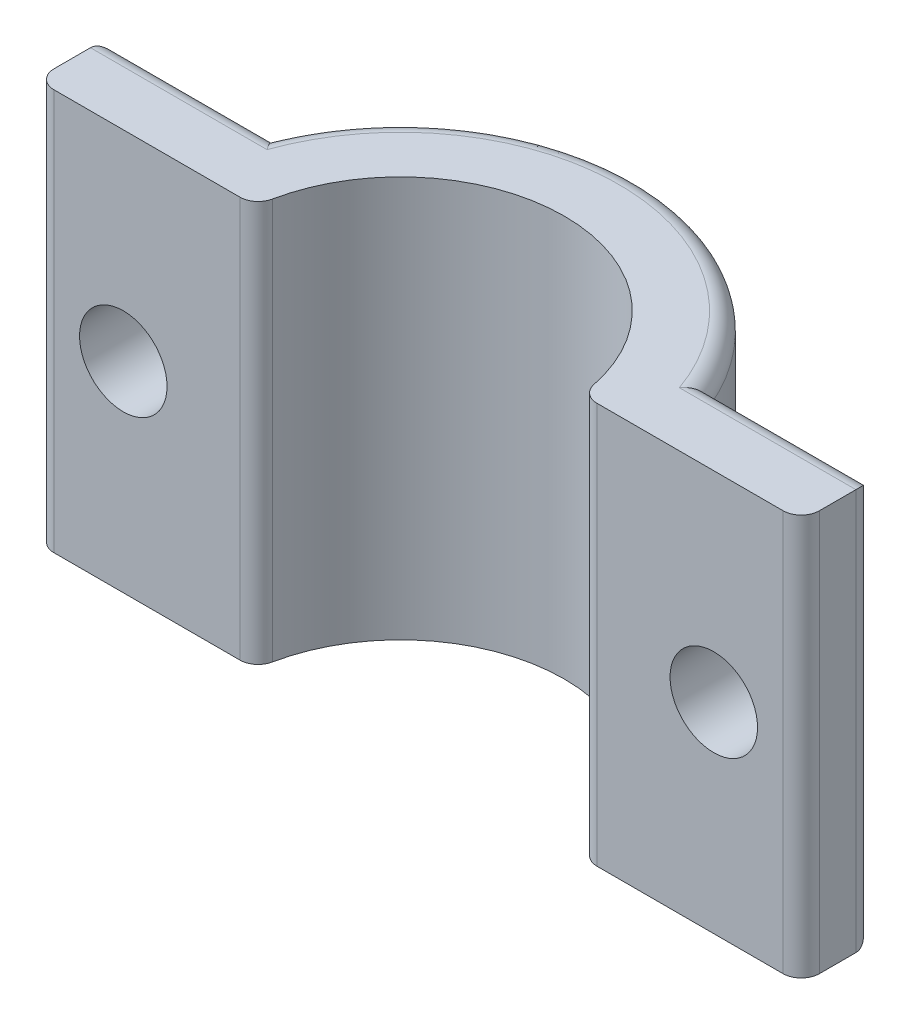
ISO-10303-21;
HEADER;
FILE_DESCRIPTION(('STEP AP214'),'2;1');
FILE_NAME('part.step','',(''),(''),'','','');
FILE_SCHEMA(('AUTOMOTIVE_DESIGN { 1 0 10303 214 1 1 1 1 }'));
ENDSEC;
DATA;
#1=APPLICATION_CONTEXT('core data for automotive mechanical design processes');
#2=APPLICATION_PROTOCOL_DEFINITION('international standard','automotive_design',2000,#1);
#3=PRODUCT_CONTEXT('',#1,'mechanical');
#4=PRODUCT('Part','Part','',(#3));
#5=PRODUCT_RELATED_PRODUCT_CATEGORY('part','',(#4));
#6=PRODUCT_DEFINITION_FORMATION('','',#4);
#7=PRODUCT_DEFINITION_CONTEXT('part definition',#1,'design');
#8=PRODUCT_DEFINITION('design','',#6,#7);
#9=PRODUCT_DEFINITION_SHAPE('','',#8);
#10=(LENGTH_UNIT() NAMED_UNIT(*) SI_UNIT(.MILLI.,.METRE.));
#11=(NAMED_UNIT(*) PLANE_ANGLE_UNIT() SI_UNIT($,.RADIAN.));
#12=(NAMED_UNIT(*) SI_UNIT($,.STERADIAN.) SOLID_ANGLE_UNIT());
#13=UNCERTAINTY_MEASURE_WITH_UNIT(LENGTH_MEASURE(1.E-05),#10,'distance_accuracy_value','');
#14=(GEOMETRIC_REPRESENTATION_CONTEXT(3) GLOBAL_UNCERTAINTY_ASSIGNED_CONTEXT((#13)) GLOBAL_UNIT_ASSIGNED_CONTEXT((#10,
#11,#12)) REPRESENTATION_CONTEXT('',''));
#15=CARTESIAN_POINT('',(0.,0.,0.));
#16=DIRECTION('',(0.,0.,1.));
#17=DIRECTION('',(1.,0.,0.));
#18=AXIS2_PLACEMENT_3D('',#15,#16,#17);
#19=CARTESIAN_POINT('',(0.,11.,-2.5));
#20=DIRECTION('',(0.,0.,-1.));
#21=DIRECTION('',(-1.,0.,0.));
#22=AXIS2_PLACEMENT_3D('',#19,#20,#21);
#23=PLANE('',#22);
#24=DIRECTION('',(0.,-1.,0.));
#25=VECTOR('',#24,1.);
#26=CARTESIAN_POINT('',(6.,11.,-2.5));
#27=LINE('',#26,#25);
#28=CARTESIAN_POINT('',(6.,10.5,-2.5));
#29=VERTEX_POINT('',#28);
#30=CARTESIAN_POINT('',(6.,0.5,-2.5));
#31=VERTEX_POINT('',#30);
#32=EDGE_CURVE('E164',#29,#31,#27,.T.);
#33=ORIENTED_EDGE('',*,*,#32,.F.);
#34=DIRECTION('',(1.,0.,0.));
#35=VECTOR('',#34,1.);
#36=CARTESIAN_POINT('',(0.,10.5,-2.5));
#37=LINE('',#36,#35);
#38=CARTESIAN_POINT('',(10.,10.5,-2.5));
#39=VERTEX_POINT('',#38);
#40=EDGE_CURVE('E179',#29,#39,#37,.T.);
#41=ORIENTED_EDGE('',*,*,#40,.T.);
#42=DIRECTION('',(0.,-1.,0.));
#43=VECTOR('',#42,1.);
#44=CARTESIAN_POINT('',(10.,0.,-2.5));
#45=LINE('',#44,#43);
#46=CARTESIAN_POINT('',(10.,0.5,-2.5));
#47=VERTEX_POINT('',#46);
#48=EDGE_CURVE('E182',#39,#47,#45,.T.);
#49=ORIENTED_EDGE('',*,*,#48,.T.);
#50=DIRECTION('',(1.,0.,0.));
#51=VECTOR('',#50,1.);
#52=CARTESIAN_POINT('',(6.,0.5,-2.5));
#53=LINE('',#52,#51);
#54=EDGE_CURVE('E181',#47,#31,#53,.F.);
#55=ORIENTED_EDGE('',*,*,#54,.T.);
#56=EDGE_LOOP('',(#33,#41,#49,#55));
#57=FACE_BOUND('',#56,.T.);
#58=CARTESIAN_POINT('',(8.1,5.5,-2.5));
#59=DIRECTION('',(0.,0.,-1.));
#60=DIRECTION('',(-1.,0.,0.));
#61=AXIS2_PLACEMENT_3D('',#58,#59,#60);
#62=CIRCLE('',#61,1.2);
#63=CARTESIAN_POINT('',(6.9,5.5,-2.5));
#64=VERTEX_POINT('',#63);
#65=EDGE_CURVE('E430',#64,#64,#62,.T.);
#66=ORIENTED_EDGE('',*,*,#65,.F.);
#67=EDGE_LOOP('',(#66));
#68=FACE_BOUND('',#67,.T.);
#69=ADVANCED_FACE('F45',(#57,#68),#23,.T.);
#70=CARTESIAN_POINT('',(0.,11.,0.));
#71=DIRECTION('',(0.,-1.,0.));
#72=DIRECTION('',(0.,0.,-1.));
#73=AXIS2_PLACEMENT_3D('',#70,#71,#72);
#74=CYLINDRICAL_SURFACE('',#73,6.5);
#75=DIRECTION('',(0.,-1.,0.));
#76=VECTOR('',#75,1.);
#77=CARTESIAN_POINT('',(-6.,11.,-2.5));
#78=LINE('',#77,#76);
#79=CARTESIAN_POINT('',(-6.,10.5,-2.5));
#80=VERTEX_POINT('',#79);
#81=CARTESIAN_POINT('',(-6.,0.5,-2.5));
#82=VERTEX_POINT('',#81);
#83=EDGE_CURVE('E167',#80,#82,#78,.T.);
#84=ORIENTED_EDGE('',*,*,#83,.F.);
#85=CARTESIAN_POINT('',(0.,10.5,0.));
#86=DIRECTION('',(0.,1.,0.));
#87=DIRECTION('',(0.,0.,1.));
#88=AXIS2_PLACEMENT_3D('',#85,#86,#87);
#89=CIRCLE('',#88,6.5);
#90=EDGE_CURVE('E161',#80,#29,#89,.F.);
#91=ORIENTED_EDGE('',*,*,#90,.T.);
#92=ORIENTED_EDGE('',*,*,#32,.T.);
#93=CARTESIAN_POINT('',(0.,0.5,0.));
#94=DIRECTION('',(0.,1.,0.));
#95=DIRECTION('',(0.,0.,1.));
#96=AXIS2_PLACEMENT_3D('',#93,#94,#95);
#97=CIRCLE('',#96,6.5);
#98=EDGE_CURVE('E173',#31,#82,#97,.T.);
#99=ORIENTED_EDGE('',*,*,#98,.T.);
#100=EDGE_LOOP('',(#84,#91,#92,#99));
#101=FACE_BOUND('',#100,.T.);
#102=ADVANCED_FACE('F163',(#101),#74,.T.);
#103=CARTESIAN_POINT('',(0.,11.,-2.5));
#104=DIRECTION('',(0.,0.,-1.));
#105=DIRECTION('',(-1.,0.,0.));
#106=AXIS2_PLACEMENT_3D('',#103,#104,#105);
#107=PLANE('',#106);
#108=CARTESIAN_POINT('',(-8.1,5.5,-2.5));
#109=DIRECTION('',(0.,0.,-1.));
#110=DIRECTION('',(-1.,0.,0.));
#111=AXIS2_PLACEMENT_3D('',#108,#109,#110);
#112=CIRCLE('',#111,1.2);
#113=CARTESIAN_POINT('',(-9.3,5.5,-2.5));
#114=VERTEX_POINT('',#113);
#115=EDGE_CURVE('E434',#114,#114,#112,.T.);
#116=ORIENTED_EDGE('',*,*,#115,.F.);
#117=EDGE_LOOP('',(#116));
#118=FACE_BOUND('',#117,.T.);
#119=DIRECTION('',(0.,-1.,0.));
#120=VECTOR('',#119,1.);
#121=CARTESIAN_POINT('',(-10.,11.,-2.5));
#122=LINE('',#121,#120);
#123=CARTESIAN_POINT('',(-10.,0.5,-2.5));
#124=VERTEX_POINT('',#123);
#125=CARTESIAN_POINT('',(-10.,10.5,-2.5));
#126=VERTEX_POINT('',#125);
#127=EDGE_CURVE('E214',#124,#126,#122,.F.);
#128=ORIENTED_EDGE('',*,*,#127,.T.);
#129=DIRECTION('',(1.,0.,0.));
#130=VECTOR('',#129,1.);
#131=CARTESIAN_POINT('',(0.,10.5,-2.5));
#132=LINE('',#131,#130);
#133=EDGE_CURVE('E218',#126,#80,#132,.T.);
#134=ORIENTED_EDGE('',*,*,#133,.T.);
#135=ORIENTED_EDGE('',*,*,#83,.T.);
#136=DIRECTION('',(1.,0.,0.));
#137=VECTOR('',#136,1.);
#138=CARTESIAN_POINT('',(-10.5,0.5,-2.5));
#139=LINE('',#138,#137);
#140=EDGE_CURVE('E216',#82,#124,#139,.F.);
#141=ORIENTED_EDGE('',*,*,#140,.T.);
#142=EDGE_LOOP('',(#128,#134,#135,#141));
#143=FACE_BOUND('',#142,.T.);
#144=ADVANCED_FACE('F396',(#118,#143),#107,.T.);
#145=CARTESIAN_POINT('',(-10.5,11.,0.));
#146=DIRECTION('',(1.,0.,0.));
#147=DIRECTION('',(0.,0.,-1.));
#148=AXIS2_PLACEMENT_3D('',#145,#146,#147);
#149=PLANE('',#148);
#150=DIRECTION('',(0.,0.,1.));
#151=VECTOR('',#150,1.);
#152=CARTESIAN_POINT('',(-10.5,0.,0.));
#153=LINE('',#152,#151);
#154=CARTESIAN_POINT('',(-10.5,0.,-2.));
#155=VERTEX_POINT('',#154);
#156=CARTESIAN_POINT('',(-10.5,0.,-1.));
#157=VERTEX_POINT('',#156);
#158=EDGE_CURVE('E322',#155,#157,#153,.T.);
#159=ORIENTED_EDGE('',*,*,#158,.T.);
#160=DIRECTION('',(0.,-1.,0.));
#161=VECTOR('',#160,1.);
#162=CARTESIAN_POINT('',(-10.5,11.,-1.));
#163=LINE('',#162,#161);
#164=CARTESIAN_POINT('',(-10.5,11.,-1.));
#165=VERTEX_POINT('',#164);
#166=EDGE_CURVE('E239',#157,#165,#163,.F.);
#167=ORIENTED_EDGE('',*,*,#166,.T.);
#168=DIRECTION('',(0.,0.,1.));
#169=VECTOR('',#168,1.);
#170=CARTESIAN_POINT('',(-10.5,11.,0.));
#171=LINE('',#170,#169);
#172=CARTESIAN_POINT('',(-10.5,11.,-2.));
#173=VERTEX_POINT('',#172);
#174=EDGE_CURVE('E325',#173,#165,#171,.T.);
#175=ORIENTED_EDGE('',*,*,#174,.F.);
#176=DIRECTION('',(0.,-1.,0.));
#177=VECTOR('',#176,1.);
#178=CARTESIAN_POINT('',(-10.5,0.,-2.));
#179=LINE('',#178,#177);
#180=EDGE_CURVE('E237',#173,#155,#179,.T.);
#181=ORIENTED_EDGE('',*,*,#180,.T.);
#182=EDGE_LOOP('',(#159,#167,#175,#181));
#183=FACE_BOUND('',#182,.T.);
#184=ADVANCED_FACE('F321',(#183),#149,.F.);
#185=CARTESIAN_POINT('',(0.,11.,-0.500000000000001));
#186=DIRECTION('',(0.,0.,1.));
#187=DIRECTION('',(1.,0.,0.));
#188=AXIS2_PLACEMENT_3D('',#185,#186,#187);
#189=PLANE('',#188);
#190=CARTESIAN_POINT('',(-8.1,5.5,-0.5));
#191=DIRECTION('',(0.,0.,1.));
#192=DIRECTION('',(1.,0.,0.));
#193=AXIS2_PLACEMENT_3D('',#190,#191,#192);
#194=CIRCLE('',#193,1.2);
#195=CARTESIAN_POINT('',(-6.9,5.5,-0.5));
#196=VERTEX_POINT('',#195);
#197=EDGE_CURVE('E309',#196,#196,#194,.F.);
#198=ORIENTED_EDGE('',*,*,#197,.T.);
#199=EDGE_LOOP('',(#198));
#200=FACE_BOUND('',#199,.T.);
#201=DIRECTION('',(-1.,0.,0.));
#202=VECTOR('',#201,1.);
#203=CARTESIAN_POINT('',(0.,11.,-0.500000000000001));
#204=LINE('',#203,#202);
#205=CARTESIAN_POINT('',(-4.89897948556635,11.,-0.500000000000001));
#206=VERTEX_POINT('',#205);
#207=CARTESIAN_POINT('',(-10.,11.,-0.5));
#208=VERTEX_POINT('',#207);
#209=EDGE_CURVE('E348',#206,#208,#204,.T.);
#210=ORIENTED_EDGE('',*,*,#209,.T.);
#211=DIRECTION('',(0.,-1.,0.));
#212=VECTOR('',#211,1.);
#213=CARTESIAN_POINT('',(-10.,0.,-0.5));
#214=LINE('',#213,#212);
#215=CARTESIAN_POINT('',(-10.,0.,-0.5));
#216=VERTEX_POINT('',#215);
#217=EDGE_CURVE('E234',#208,#216,#214,.T.);
#218=ORIENTED_EDGE('',*,*,#217,.T.);
#219=DIRECTION('',(-1.,0.,0.));
#220=VECTOR('',#219,1.);
#221=CARTESIAN_POINT('',(0.,0.,-0.500000000000001));
#222=LINE('',#221,#220);
#223=CARTESIAN_POINT('',(-4.89897948556635,0.,-0.500000000000001));
#224=VERTEX_POINT('',#223);
#225=EDGE_CURVE('E328',#224,#216,#222,.T.);
#226=ORIENTED_EDGE('',*,*,#225,.F.);
#227=DIRECTION('',(0.,-1.,0.));
#228=VECTOR('',#227,1.);
#229=CARTESIAN_POINT('',(-4.89897948556635,11.,-0.500000000000001));
#230=LINE('',#229,#228);
#231=EDGE_CURVE('E172',#224,#206,#230,.F.);
#232=ORIENTED_EDGE('',*,*,#231,.T.);
#233=EDGE_LOOP('',(#210,#218,#226,#232));
#234=FACE_BOUND('',#233,.T.);
#235=ADVANCED_FACE('F404',(#200,#234),#189,.T.);
#236=CARTESIAN_POINT('',(0.,11.,0.));
#237=DIRECTION('',(0.,-1.,0.));
#238=DIRECTION('',(0.,0.,-1.));
#239=AXIS2_PLACEMENT_3D('',#236,#237,#238);
#240=CYLINDRICAL_SURFACE('',#239,4.5);
#241=CARTESIAN_POINT('',(0.,11.,0.));
#242=DIRECTION('',(0.,1.,0.));
#243=DIRECTION('',(0.,0.,1.));
#244=AXIS2_PLACEMENT_3D('',#241,#242,#243);
#245=CIRCLE('',#244,4.5);
#246=CARTESIAN_POINT('',(4.40908153700972,11.,-0.900000000000001));
#247=VERTEX_POINT('',#246);
#248=CARTESIAN_POINT('',(-4.40908153700972,11.,-0.900000000000001));
#249=VERTEX_POINT('',#248);
#250=EDGE_CURVE('E361',#247,#249,#245,.T.);
#251=ORIENTED_EDGE('',*,*,#250,.T.);
#252=DIRECTION('',(0.,-1.,0.));
#253=VECTOR('',#252,1.);
#254=CARTESIAN_POINT('',(-4.40908153700972,11.,-0.900000000000001));
#255=LINE('',#254,#253);
#256=CARTESIAN_POINT('',(-4.40908153700972,0.,-0.900000000000001));
#257=VERTEX_POINT('',#256);
#258=EDGE_CURVE('E243',#249,#257,#255,.T.);
#259=ORIENTED_EDGE('',*,*,#258,.T.);
#260=CARTESIAN_POINT('',(0.,0.,0.));
#261=DIRECTION('',(0.,1.,0.));
#262=DIRECTION('',(0.,0.,1.));
#263=AXIS2_PLACEMENT_3D('',#260,#261,#262);
#264=CIRCLE('',#263,4.5);
#265=CARTESIAN_POINT('',(4.40908153700972,0.,-0.900000000000001));
#266=VERTEX_POINT('',#265);
#267=EDGE_CURVE('E351',#266,#257,#264,.T.);
#268=ORIENTED_EDGE('',*,*,#267,.F.);
#269=DIRECTION('',(0.,-1.,0.));
#270=VECTOR('',#269,1.);
#271=CARTESIAN_POINT('',(4.40908153700972,11.,-0.900000000000001));
#272=LINE('',#271,#270);
#273=EDGE_CURVE('E241',#266,#247,#272,.F.);
#274=ORIENTED_EDGE('',*,*,#273,.T.);
#275=EDGE_LOOP('',(#251,#259,#268,#274));
#276=FACE_BOUND('',#275,.T.);
#277=ADVANCED_FACE('F372',(#276),#240,.F.);
#278=CARTESIAN_POINT('',(0.,11.,-0.500000000000001));
#279=DIRECTION('',(0.,0.,-1.));
#280=DIRECTION('',(-1.,0.,0.));
#281=AXIS2_PLACEMENT_3D('',#278,#279,#280);
#282=PLANE('',#281);
#283=CARTESIAN_POINT('',(8.1,5.5,-0.500000000000003));
#284=DIRECTION('',(0.,0.,1.));
#285=DIRECTION('',(1.,0.,0.));
#286=AXIS2_PLACEMENT_3D('',#283,#284,#285);
#287=CIRCLE('',#286,1.2);
#288=CARTESIAN_POINT('',(9.3,5.5,-0.500000000000003));
#289=VERTEX_POINT('',#288);
#290=EDGE_CURVE('E329',#289,#289,#287,.F.);
#291=ORIENTED_EDGE('',*,*,#290,.T.);
#292=EDGE_LOOP('',(#291));
#293=FACE_BOUND('',#292,.T.);
#294=DIRECTION('',(1.,0.,0.));
#295=VECTOR('',#294,1.);
#296=CARTESIAN_POINT('',(0.,11.,-0.500000000000001));
#297=LINE('',#296,#295);
#298=CARTESIAN_POINT('',(4.89897948556635,11.,-0.500000000000001));
#299=VERTEX_POINT('',#298);
#300=CARTESIAN_POINT('',(10.,11.,-0.500000000000001));
#301=VERTEX_POINT('',#300);
#302=EDGE_CURVE('E357',#299,#301,#297,.T.);
#303=ORIENTED_EDGE('',*,*,#302,.F.);
#304=DIRECTION('',(0.,1.,0.));
#305=VECTOR('',#304,1.);
#306=CARTESIAN_POINT('',(4.89897948556635,0.,-0.500000000000001));
#307=LINE('',#306,#305);
#308=CARTESIAN_POINT('',(4.89897948556635,0.,-0.500000000000001));
#309=VERTEX_POINT('',#308);
#310=EDGE_CURVE('E248',#299,#309,#307,.F.);
#311=ORIENTED_EDGE('',*,*,#310,.T.);
#312=DIRECTION('',(1.,0.,0.));
#313=VECTOR('',#312,1.);
#314=CARTESIAN_POINT('',(0.,0.,-0.500000000000001));
#315=LINE('',#314,#313);
#316=CARTESIAN_POINT('',(10.,0.,-0.500000000000001));
#317=VERTEX_POINT('',#316);
#318=EDGE_CURVE('E346',#309,#317,#315,.T.);
#319=ORIENTED_EDGE('',*,*,#318,.T.);
#320=DIRECTION('',(0.,-1.,0.));
#321=VECTOR('',#320,1.);
#322=CARTESIAN_POINT('',(10.,11.,-0.500000000000001));
#323=LINE('',#322,#321);
#324=EDGE_CURVE('E246',#317,#301,#323,.F.);
#325=ORIENTED_EDGE('',*,*,#324,.T.);
#326=EDGE_LOOP('',(#303,#311,#319,#325));
#327=FACE_BOUND('',#326,.T.);
#328=ADVANCED_FACE('F383',(#293,#327),#282,.F.);
#329=CARTESIAN_POINT('',(10.5,11.,0.));
#330=DIRECTION('',(-1.,0.,0.));
#331=DIRECTION('',(0.,0.,1.));
#332=AXIS2_PLACEMENT_3D('',#329,#330,#331);
#333=PLANE('',#332);
#334=DIRECTION('',(0.,0.,-1.));
#335=VECTOR('',#334,1.);
#336=CARTESIAN_POINT('',(10.5,11.,0.));
#337=LINE('',#336,#335);
#338=CARTESIAN_POINT('',(10.5,11.,-1.));
#339=VERTEX_POINT('',#338);
#340=CARTESIAN_POINT('',(10.5,11.,-2.));
#341=VERTEX_POINT('',#340);
#342=EDGE_CURVE('E355',#339,#341,#337,.T.);
#343=ORIENTED_EDGE('',*,*,#342,.F.);
#344=DIRECTION('',(0.,-1.,0.));
#345=VECTOR('',#344,1.);
#346=CARTESIAN_POINT('',(10.5,11.,-1.));
#347=LINE('',#346,#345);
#348=CARTESIAN_POINT('',(10.5,0.,-1.));
#349=VERTEX_POINT('',#348);
#350=EDGE_CURVE('E11',#339,#349,#347,.T.);
#351=ORIENTED_EDGE('',*,*,#350,.T.);
#352=DIRECTION('',(0.,0.,-1.));
#353=VECTOR('',#352,1.);
#354=CARTESIAN_POINT('',(10.5,0.,0.));
#355=LINE('',#354,#353);
#356=CARTESIAN_POINT('',(10.5,0.,-2.));
#357=VERTEX_POINT('',#356);
#358=EDGE_CURVE('E340',#349,#357,#355,.T.);
#359=ORIENTED_EDGE('',*,*,#358,.T.);
#360=DIRECTION('',(0.,-1.,0.));
#361=VECTOR('',#360,1.);
#362=CARTESIAN_POINT('',(10.5,11.,-2.));
#363=LINE('',#362,#361);
#364=EDGE_CURVE('E54',#357,#341,#363,.F.);
#365=ORIENTED_EDGE('',*,*,#364,.T.);
#366=EDGE_LOOP('',(#343,#351,#359,#365));
#367=FACE_BOUND('',#366,.T.);
#368=ADVANCED_FACE('F343',(#367),#333,.F.);
#369=CARTESIAN_POINT('',(0.,11.,0.));
#370=DIRECTION('',(0.,1.,0.));
#371=DIRECTION('',(0.,0.,1.));
#372=AXIS2_PLACEMENT_3D('',#369,#370,#371);
#373=PLANE('',#372);
#374=ORIENTED_EDGE('',*,*,#342,.T.);
#375=DIRECTION('',(1.,0.,0.));
#376=VECTOR('',#375,1.);
#377=CARTESIAN_POINT('',(0.,11.,-2.));
#378=LINE('',#377,#376);
#379=CARTESIAN_POINT('',(5.65685424949238,11.,-2.));
#380=VERTEX_POINT('',#379);
#381=EDGE_CURVE('E212',#341,#380,#378,.F.);
#382=ORIENTED_EDGE('',*,*,#381,.T.);
#383=CARTESIAN_POINT('',(0.,11.,0.));
#384=DIRECTION('',(0.,1.,0.));
#385=DIRECTION('',(0.,0.,1.));
#386=AXIS2_PLACEMENT_3D('',#383,#384,#385);
#387=CIRCLE('',#386,6.);
#388=CARTESIAN_POINT('',(-5.65685424949238,11.,-2.));
#389=VERTEX_POINT('',#388);
#390=EDGE_CURVE('E187',#380,#389,#387,.T.);
#391=ORIENTED_EDGE('',*,*,#390,.T.);
#392=DIRECTION('',(1.,0.,0.));
#393=VECTOR('',#392,1.);
#394=CARTESIAN_POINT('',(0.,11.,-2.));
#395=LINE('',#394,#393);
#396=EDGE_CURVE('E210',#389,#173,#395,.F.);
#397=ORIENTED_EDGE('',*,*,#396,.T.);
#398=ORIENTED_EDGE('',*,*,#174,.T.);
#399=CARTESIAN_POINT('',(-10.,11.,-1.));
#400=DIRECTION('',(0.,1.,0.));
#401=DIRECTION('',(0.,0.,1.));
#402=AXIS2_PLACEMENT_3D('',#399,#400,#401);
#403=CIRCLE('',#402,0.5);
#404=EDGE_CURVE('E207',#165,#208,#403,.T.);
#405=ORIENTED_EDGE('',*,*,#404,.T.);
#406=ORIENTED_EDGE('',*,*,#209,.F.);
#407=CARTESIAN_POINT('',(-4.89897948556635,11.,-1.));
#408=DIRECTION('',(0.,1.,0.));
#409=DIRECTION('',(0.,0.,1.));
#410=AXIS2_PLACEMENT_3D('',#407,#408,#409);
#411=CIRCLE('',#410,0.5);
#412=EDGE_CURVE('E205',#206,#249,#411,.T.);
#413=ORIENTED_EDGE('',*,*,#412,.T.);
#414=ORIENTED_EDGE('',*,*,#250,.F.);
#415=CARTESIAN_POINT('',(4.89897948556635,11.,-1.));
#416=DIRECTION('',(0.,1.,0.));
#417=DIRECTION('',(0.,0.,1.));
#418=AXIS2_PLACEMENT_3D('',#415,#416,#417);
#419=CIRCLE('',#418,0.5);
#420=EDGE_CURVE('E199',#247,#299,#419,.T.);
#421=ORIENTED_EDGE('',*,*,#420,.T.);
#422=ORIENTED_EDGE('',*,*,#302,.T.);
#423=CARTESIAN_POINT('',(10.,11.,-1.));
#424=DIRECTION('',(0.,1.,0.));
#425=DIRECTION('',(0.,0.,1.));
#426=AXIS2_PLACEMENT_3D('',#423,#424,#425);
#427=CIRCLE('',#426,0.5);
#428=EDGE_CURVE('E197',#301,#339,#427,.T.);
#429=ORIENTED_EDGE('',*,*,#428,.T.);
#430=EDGE_LOOP('',(#374,#382,#391,#397,#398,#405,#406,#413,#414,#421,#422,#429));
#431=FACE_BOUND('',#430,.T.);
#432=ADVANCED_FACE('F380',(#431),#373,.T.);
#433=CARTESIAN_POINT('',(0.,0.,0.));
#434=DIRECTION('',(0.,1.,0.));
#435=DIRECTION('',(0.,0.,1.));
#436=AXIS2_PLACEMENT_3D('',#433,#434,#435);
#437=PLANE('',#436);
#438=ORIENTED_EDGE('',*,*,#158,.F.);
#439=DIRECTION('',(1.,0.,0.));
#440=VECTOR('',#439,1.);
#441=CARTESIAN_POINT('',(-6.,0.,-2.));
#442=LINE('',#441,#440);
#443=CARTESIAN_POINT('',(-5.65685424949238,0.,-2.));
#444=VERTEX_POINT('',#443);
#445=EDGE_CURVE('E67',#155,#444,#442,.T.);
#446=ORIENTED_EDGE('',*,*,#445,.T.);
#447=CARTESIAN_POINT('',(0.,0.,0.));
#448=DIRECTION('',(0.,1.,0.));
#449=DIRECTION('',(0.,0.,1.));
#450=AXIS2_PLACEMENT_3D('',#447,#448,#449);
#451=CIRCLE('',#450,6.);
#452=CARTESIAN_POINT('',(5.65685424949238,0.,-2.));
#453=VERTEX_POINT('',#452);
#454=EDGE_CURVE('E62',#444,#453,#451,.F.);
#455=ORIENTED_EDGE('',*,*,#454,.T.);
#456=DIRECTION('',(1.,0.,0.));
#457=VECTOR('',#456,1.);
#458=CARTESIAN_POINT('',(10.5,0.,-2.));
#459=LINE('',#458,#457);
#460=EDGE_CURVE('E229',#453,#357,#459,.T.);
#461=ORIENTED_EDGE('',*,*,#460,.T.);
#462=ORIENTED_EDGE('',*,*,#358,.F.);
#463=CARTESIAN_POINT('',(10.,0.,-1.));
#464=DIRECTION('',(0.,1.,0.));
#465=DIRECTION('',(0.,0.,1.));
#466=AXIS2_PLACEMENT_3D('',#463,#464,#465);
#467=CIRCLE('',#466,0.5);
#468=EDGE_CURVE('E220',#349,#317,#467,.F.);
#469=ORIENTED_EDGE('',*,*,#468,.T.);
#470=ORIENTED_EDGE('',*,*,#318,.F.);
#471=CARTESIAN_POINT('',(4.89897948556635,0.,-1.));
#472=DIRECTION('',(0.,1.,0.));
#473=DIRECTION('',(0.,0.,1.));
#474=AXIS2_PLACEMENT_3D('',#471,#472,#473);
#475=CIRCLE('',#474,0.5);
#476=EDGE_CURVE('E222',#309,#266,#475,.F.);
#477=ORIENTED_EDGE('',*,*,#476,.T.);
#478=ORIENTED_EDGE('',*,*,#267,.T.);
#479=CARTESIAN_POINT('',(-4.89897948556635,0.,-1.));
#480=DIRECTION('',(0.,1.,0.));
#481=DIRECTION('',(0.,0.,1.));
#482=AXIS2_PLACEMENT_3D('',#479,#480,#481);
#483=CIRCLE('',#482,0.5);
#484=EDGE_CURVE('E224',#257,#224,#483,.F.);
#485=ORIENTED_EDGE('',*,*,#484,.T.);
#486=ORIENTED_EDGE('',*,*,#225,.T.);
#487=CARTESIAN_POINT('',(-10.,0.,-1.));
#488=DIRECTION('',(0.,1.,0.));
#489=DIRECTION('',(0.,0.,1.));
#490=AXIS2_PLACEMENT_3D('',#487,#488,#489);
#491=CIRCLE('',#490,0.5);
#492=EDGE_CURVE('E226',#216,#157,#491,.F.);
#493=ORIENTED_EDGE('',*,*,#492,.T.);
#494=EDGE_LOOP('',(#438,#446,#455,#461,#462,#469,#470,#477,#478,#485,#486,#493));
#495=FACE_BOUND('',#494,.T.);
#496=ADVANCED_FACE('F326',(#495),#437,.F.);
#497=CARTESIAN_POINT('',(8.1,5.5,2.89411254969543));
#498=DIRECTION('',(0.,0.,-1.));
#499=DIRECTION('',(-1.,0.,0.));
#500=AXIS2_PLACEMENT_3D('',#497,#498,#499);
#501=CYLINDRICAL_SURFACE('',#500,1.2);
#502=ORIENTED_EDGE('',*,*,#65,.T.);
#503=EDGE_LOOP('',(#502));
#504=FACE_BOUND('',#503,.T.);
#505=ORIENTED_EDGE('',*,*,#290,.F.);
#506=EDGE_LOOP('',(#505));
#507=FACE_BOUND('',#506,.T.);
#508=ADVANCED_FACE('F417',(#504,#507),#501,.F.);
#509=CARTESIAN_POINT('',(-8.1,5.5,2.89411254969543));
#510=DIRECTION('',(0.,0.,-1.));
#511=DIRECTION('',(-1.,0.,0.));
#512=AXIS2_PLACEMENT_3D('',#509,#510,#511);
#513=CYLINDRICAL_SURFACE('',#512,1.2);
#514=ORIENTED_EDGE('',*,*,#115,.T.);
#515=EDGE_LOOP('',(#514));
#516=FACE_BOUND('',#515,.T.);
#517=ORIENTED_EDGE('',*,*,#197,.F.);
#518=EDGE_LOOP('',(#517));
#519=FACE_BOUND('',#518,.T.);
#520=ADVANCED_FACE('F420',(#516,#519),#513,.F.);
#521=CARTESIAN_POINT('',(0.,0.5,-2.));
#522=DIRECTION('',(-1.,0.,0.));
#523=DIRECTION('',(0.,0.,1.));
#524=AXIS2_PLACEMENT_3D('',#521,#522,#523);
#525=CYLINDRICAL_SURFACE('',#524,0.5);
#526=CARTESIAN_POINT('',(-6.,0.5,-2.5));
#527=CARTESIAN_POINT('',(-6.00002173580338,0.475257279397214,-2.50003467890509));
#528=CARTESIAN_POINT('',(-5.99877726352506,0.450547733458578,-2.49816588246662));
#529=CARTESIAN_POINT('',(-5.99393457540392,0.402012394616218,-2.49090519553763));
#530=CARTESIAN_POINT('',(-5.99034829975771,0.378182763006307,-2.48553117734283));
#531=CARTESIAN_POINT('',(-5.98100287487304,0.331986971649653,-2.47154688158862));
#532=CARTESIAN_POINT('',(-5.97524623656618,0.309619155656273,-2.46294034383271));
#533=CARTESIAN_POINT('',(-5.96182336087112,0.266786324555336,-2.44291156647527));
#534=CARTESIAN_POINT('',(-5.95415513369966,0.246323322854282,-2.43148639306977));
#535=CARTESIAN_POINT('',(-5.93669076611329,0.206492655455345,-2.40552710660915));
#536=CARTESIAN_POINT('',(-5.92679457929041,0.187264309795342,-2.3908476205638));
#537=CARTESIAN_POINT('',(-5.90552274928344,0.1515625336377,-2.35938571465932));
#538=CARTESIAN_POINT('',(-5.89414682002641,0.135089637251886,-2.34260288819238));
#539=CARTESIAN_POINT('',(-5.86831511672241,0.102597588054589,-2.30461632093368));
#540=CARTESIAN_POINT('',(-5.8536571274823,0.0870658123548616,-2.28313374581184));
#541=CARTESIAN_POINT('',(-5.8231553035544,0.0598337854972895,-2.2386130384289));
#542=CARTESIAN_POINT('',(-5.80730985910575,0.048138855511002,-2.21557279883125));
#543=CARTESIAN_POINT('',(-5.770074079071,0.0257150296092313,-2.16166452648314));
#544=CARTESIAN_POINT('',(-5.74840689584967,0.0162467817613824,-2.13046194464784));
#545=CARTESIAN_POINT('',(-5.70435108547189,0.00352173198913566,-2.06739214152272));
#546=CARTESIAN_POINT('',(-5.68196390942424,0.000253146005272786,-2.03552629778111));
#547=CARTESIAN_POINT('',(-5.65862682993489,4.71102715579498E-06,-2.00250709914428));
#548=CARTESIAN_POINT('',(-5.65774057964348,-2.6282801631192E-09,-2.0012534571436));
#549=CARTESIAN_POINT('',(-5.65685424949238,0.,-2.));
#550=B_SPLINE_CURVE_WITH_KNOTS('',3,(#526,#527,#528,#529,#530,#531,#532,#533,#534,#535,#536,
#537,#538,#539,#540,#541,#542,#543,#544,#545,#546,#547,#548,#549),.UNSPECIFIED.,.F.,.F.,(4,2,2,
2,2,2,2,2,2,2,2,4),(0.,0.0740742332709424,0.14777370128243,0.221388165400129,0.295079577527592,
0.373191085272369,0.451317716523507,0.541849734875035,0.632506782957617,0.749418725244223,
0.8661082226069,0.870714023705967),.UNSPECIFIED.);
#551=EDGE_CURVE('E302',#444,#82,#550,.F.);
#552=ORIENTED_EDGE('',*,*,#551,.F.);
#553=ORIENTED_EDGE('',*,*,#445,.F.);
#554=CARTESIAN_POINT('',(-10.,0.5,-2.));
#555=DIRECTION('',(-0.707106781186547,0.707106781186547,0.));
#556=DIRECTION('',(0.707106781186547,0.707106781186547,0.));
#557=AXIS2_PLACEMENT_3D('',#554,#555,#556);
#558=ELLIPSE('',#557,0.707106781186547,0.5);
#559=EDGE_CURVE('E49',#124,#155,#558,.T.);
#560=ORIENTED_EDGE('',*,*,#559,.F.);
#561=ORIENTED_EDGE('',*,*,#140,.F.);
#562=EDGE_LOOP('',(#552,#553,#560,#561));
#563=FACE_BOUND('',#562,.T.);
#564=ADVANCED_FACE('F298',(#563),#525,.T.);
#565=CARTESIAN_POINT('',(-10.,11.,-2.));
#566=DIRECTION('',(0.,1.,0.));
#567=DIRECTION('',(0.,0.,1.));
#568=AXIS2_PLACEMENT_3D('',#565,#566,#567);
#569=CYLINDRICAL_SURFACE('',#568,0.5);
#570=ORIENTED_EDGE('',*,*,#559,.T.);
#571=ORIENTED_EDGE('',*,*,#180,.F.);
#572=CARTESIAN_POINT('',(-10.,10.5,-2.));
#573=DIRECTION('',(0.707106781186547,0.707106781186547,0.));
#574=DIRECTION('',(-0.707106781186547,0.707106781186547,0.));
#575=AXIS2_PLACEMENT_3D('',#572,#573,#574);
#576=ELLIPSE('',#575,0.707106781186547,0.5);
#577=EDGE_CURVE('E292',#126,#173,#576,.T.);
#578=ORIENTED_EDGE('',*,*,#577,.F.);
#579=ORIENTED_EDGE('',*,*,#127,.F.);
#580=EDGE_LOOP('',(#570,#571,#578,#579));
#581=FACE_BOUND('',#580,.T.);
#582=ADVANCED_FACE('F296',(#581),#569,.T.);
#583=CARTESIAN_POINT('',(0.,0.5,0.));
#584=DIRECTION('',(0.,1.,0.));
#585=DIRECTION('',(0.,0.,1.));
#586=AXIS2_PLACEMENT_3D('',#583,#584,#585);
#587=TOROIDAL_SURFACE('',#586,6.,0.5);
#588=ORIENTED_EDGE('',*,*,#551,.T.);
#589=ORIENTED_EDGE('',*,*,#98,.F.);
#590=CARTESIAN_POINT('',(6.,0.5,-2.5));
#591=CARTESIAN_POINT('',(6.00002173580338,0.475257279397214,-2.50003467890509));
#592=CARTESIAN_POINT('',(5.99877726352506,0.450547733458578,-2.49816588246662));
#593=CARTESIAN_POINT('',(5.99393457540392,0.402012394616218,-2.49090519553763));
#594=CARTESIAN_POINT('',(5.99034829975771,0.378182763006307,-2.48553117734283));
#595=CARTESIAN_POINT('',(5.98100287487304,0.331986971649653,-2.47154688158862));
#596=CARTESIAN_POINT('',(5.97524623656618,0.309619155656273,-2.46294034383271));
#597=CARTESIAN_POINT('',(5.96182336087112,0.266786324555336,-2.44291156647527));
#598=CARTESIAN_POINT('',(5.95415513369966,0.246323322854282,-2.43148639306977));
#599=CARTESIAN_POINT('',(5.93669076611329,0.206492655455345,-2.40552710660915));
#600=CARTESIAN_POINT('',(5.92679457929041,0.187264309795342,-2.3908476205638));
#601=CARTESIAN_POINT('',(5.90552274928344,0.1515625336377,-2.35938571465932));
#602=CARTESIAN_POINT('',(5.89414682002641,0.135089637251886,-2.34260288819238));
#603=CARTESIAN_POINT('',(5.86831511672241,0.102597588054589,-2.30461632093368));
#604=CARTESIAN_POINT('',(5.8536571274823,0.0870658123548616,-2.28313374581184));
#605=CARTESIAN_POINT('',(5.8231553035544,0.0598337854972895,-2.2386130384289));
#606=CARTESIAN_POINT('',(5.80730985910575,0.048138855511002,-2.21557279883125));
#607=CARTESIAN_POINT('',(5.770074079071,0.0257150296092313,-2.16166452648314));
#608=CARTESIAN_POINT('',(5.74840689584967,0.0162467817613824,-2.13046194464784));
#609=CARTESIAN_POINT('',(5.70435108547189,0.00352173198913566,-2.06739214152272));
#610=CARTESIAN_POINT('',(5.68196390942424,0.000253146005272786,-2.03552629778111));
#611=CARTESIAN_POINT('',(5.65862682993489,4.71102715579498E-06,-2.00250709914428));
#612=CARTESIAN_POINT('',(5.65774057964348,-2.6282801631192E-09,-2.0012534571436));
#613=CARTESIAN_POINT('',(5.65685424949238,0.,-2.));
#614=B_SPLINE_CURVE_WITH_KNOTS('',3,(#590,#591,#592,#593,#594,#595,#596,#597,#598,#599,#600,
#601,#602,#603,#604,#605,#606,#607,#608,#609,#610,#611,#612,#613),.UNSPECIFIED.,.F.,.F.,(4,2,2,
2,2,2,2,2,2,2,2,4),(0.,0.0740742332709424,0.14777370128243,0.221388165400129,0.295079577527592,
0.373191085272369,0.451317716523507,0.541849734875035,0.632506782957617,0.749418725244223,
0.8661082226069,0.870714023705967),.UNSPECIFIED.);
#615=EDGE_CURVE('E285',#453,#31,#614,.F.);
#616=ORIENTED_EDGE('',*,*,#615,.F.);
#617=ORIENTED_EDGE('',*,*,#454,.F.);
#618=EDGE_LOOP('',(#588,#589,#616,#617));
#619=FACE_BOUND('',#618,.T.);
#620=ADVANCED_FACE('F275',(#619),#587,.T.);
#621=CARTESIAN_POINT('',(0.,10.5,-2.));
#622=DIRECTION('',(1.,0.,0.));
#623=DIRECTION('',(0.,0.,-1.));
#624=AXIS2_PLACEMENT_3D('',#621,#622,#623);
#625=CYLINDRICAL_SURFACE('',#624,0.5);
#626=ORIENTED_EDGE('',*,*,#577,.T.);
#627=ORIENTED_EDGE('',*,*,#396,.F.);
#628=CARTESIAN_POINT('',(-6.,10.5,-2.5));
#629=CARTESIAN_POINT('',(-6.00002173580338,10.5247427206028,-2.50003467890509));
#630=CARTESIAN_POINT('',(-5.99877726352506,10.5494522665414,-2.49816588246662));
#631=CARTESIAN_POINT('',(-5.99393457540393,10.5979876053838,-2.49090519553763));
#632=CARTESIAN_POINT('',(-5.99034829975771,10.6218172369937,-2.48553117734283));
#633=CARTESIAN_POINT('',(-5.98100287487304,10.6680130283503,-2.47154688158862));
#634=CARTESIAN_POINT('',(-5.97524623656618,10.6903808443437,-2.46294034383271));
#635=CARTESIAN_POINT('',(-5.96182336087112,10.7332136754447,-2.44291156647527));
#636=CARTESIAN_POINT('',(-5.95415513369966,10.7536766771457,-2.43148639306977));
#637=CARTESIAN_POINT('',(-5.93669076611329,10.7935073445447,-2.40552710660915));
#638=CARTESIAN_POINT('',(-5.92679457929041,10.8127356902047,-2.3908476205638));
#639=CARTESIAN_POINT('',(-5.90552274928344,10.8484374663623,-2.35938571465932));
#640=CARTESIAN_POINT('',(-5.89414682002641,10.8649103627481,-2.34260288819237));
#641=CARTESIAN_POINT('',(-5.86831511672241,10.8974024119454,-2.30461632093368));
#642=CARTESIAN_POINT('',(-5.85365712748229,10.9129341876451,-2.28313374581185));
#643=CARTESIAN_POINT('',(-5.8231553035544,10.9401662145027,-2.23861303842889));
#644=CARTESIAN_POINT('',(-5.80730985910578,10.951861144489,-2.21557279883123));
#645=CARTESIAN_POINT('',(-5.77007407907097,10.9742849703908,-2.16166452648316));
#646=CARTESIAN_POINT('',(-5.74840689584954,10.9837532182386,-2.13046194464792));
#647=CARTESIAN_POINT('',(-5.70435108547202,10.9964782680109,-2.06739214152263));
#648=CARTESIAN_POINT('',(-5.68196390942471,10.9997468539947,-2.03552629778077));
#649=CARTESIAN_POINT('',(-5.65862682993493,10.9999952889728,-2.00250709914426));
#650=CARTESIAN_POINT('',(-5.6577405796435,11.0000000026283,-2.00125345714358));
#651=CARTESIAN_POINT('',(-5.65685424949238,11.,-2.));
#652=B_SPLINE_CURVE_WITH_KNOTS('',3,(#628,#629,#630,#631,#632,#633,#634,#635,#636,#637,#638,
#639,#640,#641,#642,#643,#644,#645,#646,#647,#648,#649,#650,#651),.UNSPECIFIED.,.F.,.F.,(4,2,2,
2,2,2,2,2,2,2,2,4),(0.,0.0740742332709402,0.14777370128243,0.221388165400128,0.295079577527593,
0.373191085272371,0.451317716523507,0.541849734875035,0.632506782957618,0.749418725244228,
0.866108222606901,0.870714023705967),.UNSPECIFIED.);
#653=EDGE_CURVE('E279',#80,#389,#652,.T.);
#654=ORIENTED_EDGE('',*,*,#653,.F.);
#655=ORIENTED_EDGE('',*,*,#133,.F.);
#656=EDGE_LOOP('',(#626,#627,#654,#655));
#657=FACE_BOUND('',#656,.T.);
#658=ADVANCED_FACE('F270',(#657),#625,.T.);
#659=CARTESIAN_POINT('',(0.,0.5,-2.));
#660=DIRECTION('',(-1.,0.,0.));
#661=DIRECTION('',(0.,0.,1.));
#662=AXIS2_PLACEMENT_3D('',#659,#660,#661);
#663=CYLINDRICAL_SURFACE('',#662,0.5);
#664=ORIENTED_EDGE('',*,*,#615,.T.);
#665=ORIENTED_EDGE('',*,*,#54,.F.);
#666=CARTESIAN_POINT('',(10.,0.5,-2.));
#667=DIRECTION('',(0.707106781186547,0.707106781186547,0.));
#668=DIRECTION('',(-0.707106781186547,0.707106781186547,0.));
#669=AXIS2_PLACEMENT_3D('',#666,#667,#668);
#670=ELLIPSE('',#669,0.707106781186547,0.5);
#671=EDGE_CURVE('E191',#357,#47,#670,.T.);
#672=ORIENTED_EDGE('',*,*,#671,.F.);
#673=ORIENTED_EDGE('',*,*,#460,.F.);
#674=EDGE_LOOP('',(#664,#665,#672,#673));
#675=FACE_BOUND('',#674,.T.);
#676=ADVANCED_FACE('F274',(#675),#663,.T.);
#677=CARTESIAN_POINT('',(0.,10.5,0.));
#678=DIRECTION('',(0.,1.,0.));
#679=DIRECTION('',(0.,0.,1.));
#680=AXIS2_PLACEMENT_3D('',#677,#678,#679);
#681=TOROIDAL_SURFACE('',#680,6.,0.5);
#682=ORIENTED_EDGE('',*,*,#653,.T.);
#683=ORIENTED_EDGE('',*,*,#390,.F.);
#684=CARTESIAN_POINT('',(6.,10.5,-2.5));
#685=CARTESIAN_POINT('',(6.00002173580338,10.5247427206028,-2.50003467890509));
#686=CARTESIAN_POINT('',(5.99877726352506,10.5494522665414,-2.49816588246662));
#687=CARTESIAN_POINT('',(5.99393457540393,10.5979876053838,-2.49090519553763));
#688=CARTESIAN_POINT('',(5.99034829975771,10.6218172369937,-2.48553117734283));
#689=CARTESIAN_POINT('',(5.98100287487304,10.6680130283503,-2.47154688158862));
#690=CARTESIAN_POINT('',(5.97524623656618,10.6903808443437,-2.46294034383271));
#691=CARTESIAN_POINT('',(5.96182336087112,10.7332136754447,-2.44291156647527));
#692=CARTESIAN_POINT('',(5.95415513369966,10.7536766771457,-2.43148639306977));
#693=CARTESIAN_POINT('',(5.93669076611329,10.7935073445447,-2.40552710660915));
#694=CARTESIAN_POINT('',(5.92679457929041,10.8127356902047,-2.3908476205638));
#695=CARTESIAN_POINT('',(5.90552274928344,10.8484374663623,-2.35938571465932));
#696=CARTESIAN_POINT('',(5.89414682002641,10.8649103627481,-2.34260288819237));
#697=CARTESIAN_POINT('',(5.86831511672241,10.8974024119454,-2.30461632093368));
#698=CARTESIAN_POINT('',(5.85365712748229,10.9129341876451,-2.28313374581185));
#699=CARTESIAN_POINT('',(5.8231553035544,10.9401662145027,-2.23861303842889));
#700=CARTESIAN_POINT('',(5.80730985910578,10.951861144489,-2.21557279883123));
#701=CARTESIAN_POINT('',(5.77007407907097,10.9742849703908,-2.16166452648316));
#702=CARTESIAN_POINT('',(5.74840689584954,10.9837532182386,-2.13046194464792));
#703=CARTESIAN_POINT('',(5.70435108547202,10.9964782680109,-2.06739214152263));
#704=CARTESIAN_POINT('',(5.68196390942471,10.9997468539947,-2.03552629778077));
#705=CARTESIAN_POINT('',(5.65862682993493,10.9999952889728,-2.00250709914426));
#706=CARTESIAN_POINT('',(5.6577405796435,11.0000000026283,-2.00125345714358));
#707=CARTESIAN_POINT('',(5.65685424949238,11.,-2.));
#708=B_SPLINE_CURVE_WITH_KNOTS('',3,(#684,#685,#686,#687,#688,#689,#690,#691,#692,#693,#694,
#695,#696,#697,#698,#699,#700,#701,#702,#703,#704,#705,#706,#707),.UNSPECIFIED.,.F.,.F.,(4,2,2,
2,2,2,2,2,2,2,2,4),(0.,0.0740742332709402,0.14777370128243,0.221388165400128,0.295079577527593,
0.373191085272371,0.451317716523507,0.541849734875035,0.632506782957618,0.749418725244228,
0.866108222606901,0.870714023705967),.UNSPECIFIED.);
#709=EDGE_CURVE('E185',#29,#380,#708,.T.);
#710=ORIENTED_EDGE('',*,*,#709,.F.);
#711=ORIENTED_EDGE('',*,*,#90,.F.);
#712=EDGE_LOOP('',(#682,#683,#710,#711));
#713=FACE_BOUND('',#712,.T.);
#714=ADVANCED_FACE('F186',(#713),#681,.T.);
#715=CARTESIAN_POINT('',(10.,11.,-2.));
#716=DIRECTION('',(0.,1.,0.));
#717=DIRECTION('',(0.,0.,1.));
#718=AXIS2_PLACEMENT_3D('',#715,#716,#717);
#719=CYLINDRICAL_SURFACE('',#718,0.5);
#720=ORIENTED_EDGE('',*,*,#671,.T.);
#721=ORIENTED_EDGE('',*,*,#48,.F.);
#722=CARTESIAN_POINT('',(10.,10.5,-2.));
#723=DIRECTION('',(-0.707106781186547,0.707106781186547,0.));
#724=DIRECTION('',(0.707106781186547,0.707106781186547,0.));
#725=AXIS2_PLACEMENT_3D('',#722,#723,#724);
#726=ELLIPSE('',#725,0.707106781186547,0.5);
#727=EDGE_CURVE('E192',#341,#39,#726,.T.);
#728=ORIENTED_EDGE('',*,*,#727,.F.);
#729=ORIENTED_EDGE('',*,*,#364,.F.);
#730=EDGE_LOOP('',(#720,#721,#728,#729));
#731=FACE_BOUND('',#730,.T.);
#732=ADVANCED_FACE('F266',(#731),#719,.T.);
#733=CARTESIAN_POINT('',(0.,10.5,-2.));
#734=DIRECTION('',(1.,0.,0.));
#735=DIRECTION('',(0.,0.,-1.));
#736=AXIS2_PLACEMENT_3D('',#733,#734,#735);
#737=CYLINDRICAL_SURFACE('',#736,0.5);
#738=ORIENTED_EDGE('',*,*,#709,.T.);
#739=ORIENTED_EDGE('',*,*,#381,.F.);
#740=ORIENTED_EDGE('',*,*,#727,.T.);
#741=ORIENTED_EDGE('',*,*,#40,.F.);
#742=EDGE_LOOP('',(#738,#739,#740,#741));
#743=FACE_BOUND('',#742,.T.);
#744=ADVANCED_FACE('F194',(#743),#737,.T.);
#745=CARTESIAN_POINT('',(-10.,11.,-1.));
#746=DIRECTION('',(0.,1.,0.));
#747=DIRECTION('',(0.,0.,1.));
#748=AXIS2_PLACEMENT_3D('',#745,#746,#747);
#749=CYLINDRICAL_SURFACE('',#748,0.5);
#750=ORIENTED_EDGE('',*,*,#404,.F.);
#751=ORIENTED_EDGE('',*,*,#166,.F.);
#752=ORIENTED_EDGE('',*,*,#492,.F.);
#753=ORIENTED_EDGE('',*,*,#217,.F.);
#754=EDGE_LOOP('',(#750,#751,#752,#753));
#755=FACE_BOUND('',#754,.T.);
#756=ADVANCED_FACE('F265',(#755),#749,.T.);
#757=CARTESIAN_POINT('',(-4.89897948556635,11.,-1.));
#758=DIRECTION('',(0.,-1.,0.));
#759=DIRECTION('',(0.,0.,-1.));
#760=AXIS2_PLACEMENT_3D('',#757,#758,#759);
#761=CYLINDRICAL_SURFACE('',#760,0.5);
#762=ORIENTED_EDGE('',*,*,#412,.F.);
#763=ORIENTED_EDGE('',*,*,#231,.F.);
#764=ORIENTED_EDGE('',*,*,#484,.F.);
#765=ORIENTED_EDGE('',*,*,#258,.F.);
#766=EDGE_LOOP('',(#762,#763,#764,#765));
#767=FACE_BOUND('',#766,.T.);
#768=ADVANCED_FACE('F390',(#767),#761,.T.);
#769=CARTESIAN_POINT('',(4.89897948556635,11.,-1.));
#770=DIRECTION('',(0.,-1.,0.));
#771=DIRECTION('',(0.,0.,-1.));
#772=AXIS2_PLACEMENT_3D('',#769,#770,#771);
#773=CYLINDRICAL_SURFACE('',#772,0.5);
#774=ORIENTED_EDGE('',*,*,#420,.F.);
#775=ORIENTED_EDGE('',*,*,#273,.F.);
#776=ORIENTED_EDGE('',*,*,#476,.F.);
#777=ORIENTED_EDGE('',*,*,#310,.F.);
#778=EDGE_LOOP('',(#774,#775,#776,#777));
#779=FACE_BOUND('',#778,.T.);
#780=ADVANCED_FACE('F377',(#779),#773,.T.);
#781=CARTESIAN_POINT('',(10.,11.,-1.));
#782=DIRECTION('',(0.,-1.,0.));
#783=DIRECTION('',(0.,0.,-1.));
#784=AXIS2_PLACEMENT_3D('',#781,#782,#783);
#785=CYLINDRICAL_SURFACE('',#784,0.5);
#786=ORIENTED_EDGE('',*,*,#428,.F.);
#787=ORIENTED_EDGE('',*,*,#324,.F.);
#788=ORIENTED_EDGE('',*,*,#468,.F.);
#789=ORIENTED_EDGE('',*,*,#350,.F.);
#790=EDGE_LOOP('',(#786,#787,#788,#789));
#791=FACE_BOUND('',#790,.T.);
#792=ADVANCED_FACE('F47',(#791),#785,.T.);
#793=CLOSED_SHELL('',(#69,#102,#144,#184,#235,#277,#328,#368,#432,#496,#508,#520,#564,#582,#620,
#658,#676,#714,#732,#744,#756,#768,#780,#792));
#794=MANIFOLD_SOLID_BREP('B2',#793);
#795=ADVANCED_BREP_SHAPE_REPRESENTATION('',(#18,#794),#14);
#796=SHAPE_DEFINITION_REPRESENTATION(#9,#795);
ENDSEC;
END-ISO-10303-21;
